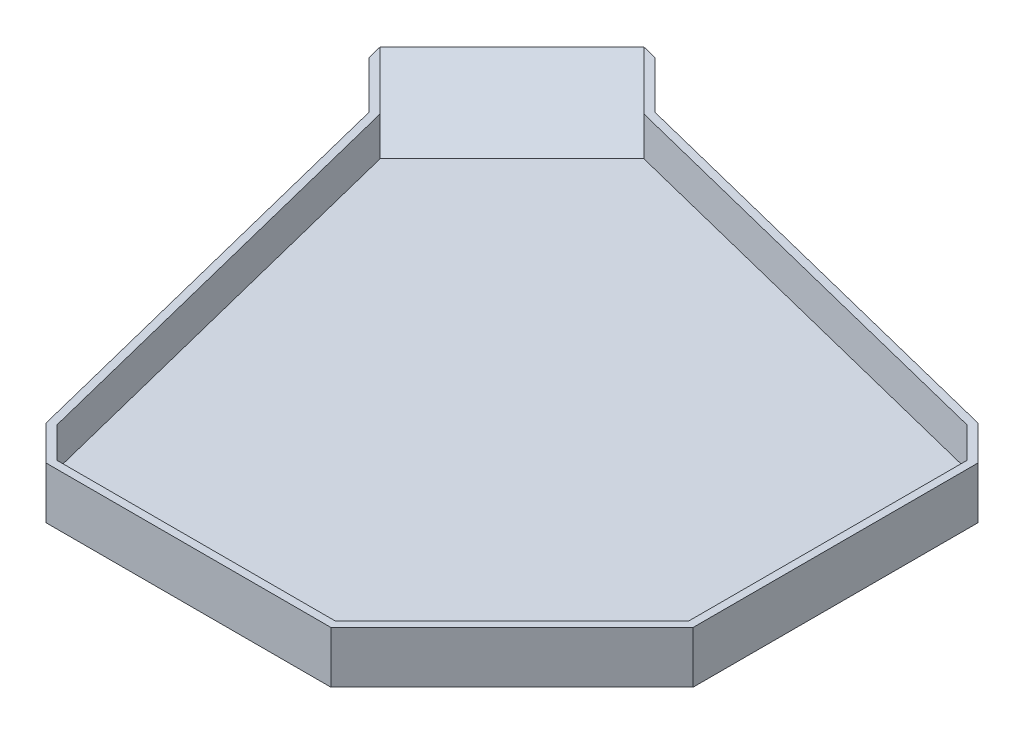
ISO-10303-21;
HEADER;
FILE_DESCRIPTION(('STEP AP214'),'2;1');
FILE_NAME('part.step','',(''),(''),'','','');
FILE_SCHEMA(('AUTOMOTIVE_DESIGN { 1 0 10303 214 1 1 1 1 }'));
ENDSEC;
DATA;
#1=APPLICATION_CONTEXT('core data for automotive mechanical design processes');
#2=APPLICATION_PROTOCOL_DEFINITION('international standard','automotive_design',2000,#1);
#3=PRODUCT_CONTEXT('',#1,'mechanical');
#4=PRODUCT('Part','Part','',(#3));
#5=PRODUCT_RELATED_PRODUCT_CATEGORY('part','',(#4));
#6=PRODUCT_DEFINITION_FORMATION('','',#4);
#7=PRODUCT_DEFINITION_CONTEXT('part definition',#1,'design');
#8=PRODUCT_DEFINITION('design','',#6,#7);
#9=PRODUCT_DEFINITION_SHAPE('','',#8);
#10=(LENGTH_UNIT() NAMED_UNIT(*) SI_UNIT(.MILLI.,.METRE.));
#11=(NAMED_UNIT(*) PLANE_ANGLE_UNIT() SI_UNIT($,.RADIAN.));
#12=(NAMED_UNIT(*) SI_UNIT($,.STERADIAN.) SOLID_ANGLE_UNIT());
#13=UNCERTAINTY_MEASURE_WITH_UNIT(LENGTH_MEASURE(1.E-05),#10,'distance_accuracy_value','');
#14=(GEOMETRIC_REPRESENTATION_CONTEXT(3) GLOBAL_UNCERTAINTY_ASSIGNED_CONTEXT((#13)) GLOBAL_UNIT_ASSIGNED_CONTEXT((#10,
#11,#12)) REPRESENTATION_CONTEXT('',''));
#15=CARTESIAN_POINT('',(0.,0.,0.));
#16=DIRECTION('',(0.,0.,1.));
#17=DIRECTION('',(1.,0.,0.));
#18=AXIS2_PLACEMENT_3D('',#15,#16,#17);
#19=CARTESIAN_POINT('',(0.,5.,0.));
#20=DIRECTION('',(0.,1.,0.));
#21=DIRECTION('',(0.,0.,1.));
#22=AXIS2_PLACEMENT_3D('',#19,#20,#21);
#23=PLANE('',#22);
#24=DIRECTION('',(0.970142500145332,0.,0.242535625036333));
#25=VECTOR('',#24,1.);
#26=CARTESIAN_POINT('',(175.132918042792,5.,-0.62444127008876));
#27=LINE('',#26,#25);
#28=CARTESIAN_POINT('',(8.67524312779766,5.,-42.2388599988373));
#29=VERTEX_POINT('',#28);
#30=CARTESIAN_POINT('',(175.132918042792,5.,-0.62444127008876));
#31=VERTEX_POINT('',#30);
#32=EDGE_CURVE('E306',#29,#31,#27,.T.);
#33=ORIENTED_EDGE('',*,*,#32,.F.);
#34=DIRECTION('',(0.707106781186551,0.,-0.707106781186544));
#35=VECTOR('',#34,1.);
#36=CARTESIAN_POINT('',(-42.236445117634,5.,8.67282824659385));
#37=LINE('',#36,#35);
#38=CARTESIAN_POINT('',(-42.236445117634,5.,8.67282824659385));
#39=VERTEX_POINT('',#38);
#40=EDGE_CURVE('E231',#39,#29,#37,.T.);
#41=ORIENTED_EDGE('',*,*,#40,.F.);
#42=DIRECTION('',(0.707106781186544,0.,0.707106781186551));
#43=VECTOR('',#42,1.);
#44=CARTESIAN_POINT('',(-42.236445117634,5.,8.67282824659385));
#45=LINE('',#44,#43);
#46=CARTESIAN_POINT('',(-64.6470248375392,5.,-13.7377514733116));
#47=VERTEX_POINT('',#46);
#48=EDGE_CURVE('E218',#47,#39,#45,.T.);
#49=ORIENTED_EDGE('',*,*,#48,.F.);
#50=DIRECTION('',(0.707106781186547,0.,-0.707106781186548));
#51=VECTOR('',#50,1.);
#52=CARTESIAN_POINT('',(-13.7353365921076,5.,-64.6494397187426));
#53=LINE('',#52,#51);
#54=CARTESIAN_POINT('',(-64.6494397187426,5.,-13.7353365921076));
#55=VERTEX_POINT('',#54);
#56=EDGE_CURVE('E230',#55,#47,#53,.T.);
#57=ORIENTED_EDGE('',*,*,#56,.F.);
#58=DIRECTION('',(-0.707106781186547,0.,-0.707106781186548));
#59=VECTOR('',#58,1.);
#60=CARTESIAN_POINT('',(-42.2388599988374,5.,8.67524312779763));
#61=LINE('',#60,#59);
#62=CARTESIAN_POINT('',(-42.2388599988374,5.,8.67524312779763));
#63=VERTEX_POINT('',#62);
#64=EDGE_CURVE('E60',#63,#55,#61,.T.);
#65=ORIENTED_EDGE('',*,*,#64,.F.);
#66=DIRECTION('',(-0.242535625036333,0.,-0.970142500145332));
#67=VECTOR('',#66,1.);
#68=CARTESIAN_POINT('',(-0.624441270088747,5.,175.132918042792));
#69=LINE('',#68,#67);
#70=CARTESIAN_POINT('',(-0.624441270088747,5.,175.132918042792));
#71=VERTEX_POINT('',#70);
#72=EDGE_CURVE('E64',#71,#63,#69,.T.);
#73=ORIENTED_EDGE('',*,*,#72,.F.);
#74=DIRECTION('',(-0.707106781186549,0.,-0.707106781186546));
#75=VECTOR('',#74,1.);
#76=CARTESIAN_POINT('',(-0.624441270088747,5.,175.132918042792));
#77=LINE('',#76,#75);
#78=CARTESIAN_POINT('',(11.2426406871193,5.,187.));
#79=VERTEX_POINT('',#78);
#80=EDGE_CURVE('E326',#79,#71,#77,.T.);
#81=ORIENTED_EDGE('',*,*,#80,.F.);
#82=DIRECTION('',(-1.,0.,0.));
#83=VECTOR('',#82,1.);
#84=CARTESIAN_POINT('',(11.2426406871193,5.,187.));
#85=LINE('',#84,#83);
#86=CARTESIAN_POINT('',(118.757359312881,5.,187.));
#87=VERTEX_POINT('',#86);
#88=EDGE_CURVE('E322',#87,#79,#85,.T.);
#89=ORIENTED_EDGE('',*,*,#88,.F.);
#90=DIRECTION('',(-0.707106781186546,0.,0.707106781186549));
#91=VECTOR('',#90,1.);
#92=CARTESIAN_POINT('',(118.757359312881,5.,187.));
#93=LINE('',#92,#91);
#94=CARTESIAN_POINT('',(187.,5.,118.757359312881));
#95=VERTEX_POINT('',#94);
#96=EDGE_CURVE('E318',#95,#87,#93,.T.);
#97=ORIENTED_EDGE('',*,*,#96,.F.);
#98=DIRECTION('',(0.,0.,1.));
#99=VECTOR('',#98,1.);
#100=CARTESIAN_POINT('',(187.,5.,118.757359312881));
#101=LINE('',#100,#99);
#102=CARTESIAN_POINT('',(187.,5.,11.2426406871192));
#103=VERTEX_POINT('',#102);
#104=EDGE_CURVE('E314',#103,#95,#101,.T.);
#105=ORIENTED_EDGE('',*,*,#104,.F.);
#106=DIRECTION('',(0.70710678118655,0.,0.707106781186545));
#107=VECTOR('',#106,1.);
#108=CARTESIAN_POINT('',(187.,5.,11.2426406871192));
#109=LINE('',#108,#107);
#110=EDGE_CURVE('E310',#31,#103,#109,.T.);
#111=ORIENTED_EDGE('',*,*,#110,.F.);
#112=EDGE_LOOP('',(#33,#41,#49,#57,#65,#73,#81,#89,#97,#105,#111));
#113=FACE_BOUND('',#112,.T.);
#114=ADVANCED_FACE('F43',(#113),#23,.T.);
#115=CARTESIAN_POINT('',(8.67524312779766,20.,-42.2388599988373));
#116=DIRECTION('',(0.707106781186551,0.,-0.707106781186544));
#117=DIRECTION('',(-0.707106781186544,0.,-0.707106781186551));
#118=AXIS2_PLACEMENT_3D('',#115,#116,#117);
#119=PLANE('',#118);
#120=DIRECTION('',(-0.639137716672717,0.42779195674155,-0.639137716672723));
#121=VECTOR('',#120,1.);
#122=CARTESIAN_POINT('',(-13.7353365921075,20.,-64.6494397187427));
#123=LINE('',#122,#121);
#124=CARTESIAN_POINT('',(-13.7353365921076,20.,-64.6494397187426));
#125=VERTEX_POINT('',#124);
#126=EDGE_CURVE('E226',#29,#125,#123,.T.);
#127=ORIENTED_EDGE('',*,*,#126,.F.);
#128=DIRECTION('',(0.,-1.,0.));
#129=VECTOR('',#128,1.);
#130=CARTESIAN_POINT('',(8.67524312779766,20.,-42.2388599988373));
#131=LINE('',#130,#129);
#132=CARTESIAN_POINT('',(8.67524312779766,20.,-42.2388599988373));
#133=VERTEX_POINT('',#132);
#134=EDGE_CURVE('E358',#133,#29,#131,.T.);
#135=ORIENTED_EDGE('',*,*,#134,.F.);
#136=DIRECTION('',(0.707106781186544,0.,0.707106781186551));
#137=VECTOR('',#136,1.);
#138=CARTESIAN_POINT('',(8.67524312779766,20.,-42.2388599988373));
#139=LINE('',#138,#137);
#140=EDGE_CURVE('E279',#125,#133,#139,.T.);
#141=ORIENTED_EDGE('',*,*,#140,.F.);
#142=EDGE_LOOP('',(#127,#135,#141));
#143=FACE_BOUND('',#142,.T.);
#144=ADVANCED_FACE('F564',(#143),#119,.F.);
#145=CARTESIAN_POINT('',(-39.3933982822018,-15.,0.606601717798213));
#146=DIRECTION('',(-0.707106781186548,0.,-0.707106781186547));
#147=DIRECTION('',(-0.707106781186547,0.,0.707106781186548));
#148=AXIS2_PLACEMENT_3D('',#145,#146,#147);
#149=PLANE('',#148);
#150=DIRECTION('',(0.707106781186548,0.,-0.707106781186547));
#151=VECTOR('',#150,1.);
#152=CARTESIAN_POINT('',(-41.8198051533946,-7.5,3.03300858899107));
#153=LINE('',#152,#151);
#154=CARTESIAN_POINT('',(-39.3933982822018,-7.5,0.60660171779821));
#155=VERTEX_POINT('',#154);
#156=CARTESIAN_POINT('',(0.606601717798211,-7.5,-39.3933982822018));
#157=VERTEX_POINT('',#156);
#158=EDGE_CURVE('E373',#155,#157,#153,.T.);
#159=ORIENTED_EDGE('',*,*,#158,.T.);
#160=DIRECTION('',(0.,1.,0.));
#161=VECTOR('',#160,1.);
#162=CARTESIAN_POINT('',(0.606601717798211,-15.,-39.3933982822018));
#163=LINE('',#162,#161);
#164=CARTESIAN_POINT('',(0.606601717798211,0.,-39.3933982822018));
#165=VERTEX_POINT('',#164);
#166=EDGE_CURVE('E398',#157,#165,#163,.T.);
#167=ORIENTED_EDGE('',*,*,#166,.T.);
#168=DIRECTION('',(-0.707106781186547,0.,0.707106781186548));
#169=VECTOR('',#168,1.);
#170=CARTESIAN_POINT('',(-39.3933982822018,0.,0.606601717798213));
#171=LINE('',#170,#169);
#172=CARTESIAN_POINT('',(-39.3933982822018,0.,0.606601717798213));
#173=VERTEX_POINT('',#172);
#174=EDGE_CURVE('E384',#165,#173,#171,.T.);
#175=ORIENTED_EDGE('',*,*,#174,.T.);
#176=DIRECTION('',(0.,1.,0.));
#177=VECTOR('',#176,1.);
#178=CARTESIAN_POINT('',(-39.3933982822018,-15.,0.606601717798213));
#179=LINE('',#178,#177);
#180=EDGE_CURVE('E395',#155,#173,#179,.T.);
#181=ORIENTED_EDGE('',*,*,#180,.F.);
#182=EDGE_LOOP('',(#159,#167,#175,#181));
#183=FACE_BOUND('',#182,.T.);
#184=ADVANCED_FACE('F603',(#183),#149,.F.);
#185=CARTESIAN_POINT('',(0.,0.,0.));
#186=DIRECTION('',(0.,1.,0.));
#187=DIRECTION('',(0.,0.,1.));
#188=AXIS2_PLACEMENT_3D('',#185,#186,#187);
#189=PLANE('',#188);
#190=DIRECTION('',(-0.707106781186547,0.,-0.707106781186548));
#191=VECTOR('',#190,1.);
#192=CARTESIAN_POINT('',(-8.07848234261526,0.,-63.2352261563695));
#193=LINE('',#192,#191);
#194=CARTESIAN_POINT('',(10.2089917516723,0.,-44.9477520620819));
#195=VERTEX_POINT('',#194);
#196=CARTESIAN_POINT('',(-8.07848234261526,0.,-63.2352261563695));
#197=VERTEX_POINT('',#196);
#198=EDGE_CURVE('E479',#195,#197,#193,.T.);
#199=ORIENTED_EDGE('',*,*,#198,.F.);
#200=DIRECTION('',(-0.970142500145332,0.,-0.242535625036333));
#201=VECTOR('',#200,1.);
#202=CARTESIAN_POINT('',(-10.,0.,-50.));
#203=LINE('',#202,#201);
#204=CARTESIAN_POINT('',(176.666666666667,0.,-3.33333333333332));
#205=VERTEX_POINT('',#204);
#206=EDGE_CURVE('E424',#205,#195,#203,.T.);
#207=ORIENTED_EDGE('',*,*,#206,.F.);
#208=DIRECTION('',(-0.707106781186548,0.,-0.707106781186547));
#209=VECTOR('',#208,1.);
#210=CARTESIAN_POINT('',(176.666666666667,0.,-3.33333333333332));
#211=LINE('',#210,#209);
#212=CARTESIAN_POINT('',(190.,0.,10.));
#213=VERTEX_POINT('',#212);
#214=EDGE_CURVE('E421',#213,#205,#211,.T.);
#215=ORIENTED_EDGE('',*,*,#214,.F.);
#216=DIRECTION('',(0.,0.,-1.));
#217=VECTOR('',#216,1.);
#218=CARTESIAN_POINT('',(190.,0.,10.));
#219=LINE('',#218,#217);
#220=CARTESIAN_POINT('',(190.,0.,120.));
#221=VERTEX_POINT('',#220);
#222=EDGE_CURVE('E418',#221,#213,#219,.T.);
#223=ORIENTED_EDGE('',*,*,#222,.F.);
#224=DIRECTION('',(0.707106781186548,0.,-0.707106781186547));
#225=VECTOR('',#224,1.);
#226=CARTESIAN_POINT('',(190.,0.,120.));
#227=LINE('',#226,#225);
#228=CARTESIAN_POINT('',(120.,0.,190.));
#229=VERTEX_POINT('',#228);
#230=EDGE_CURVE('E415',#229,#221,#227,.T.);
#231=ORIENTED_EDGE('',*,*,#230,.F.);
#232=DIRECTION('',(1.,0.,0.));
#233=VECTOR('',#232,1.);
#234=CARTESIAN_POINT('',(10.,0.,190.));
#235=LINE('',#234,#233);
#236=CARTESIAN_POINT('',(10.,0.,190.));
#237=VERTEX_POINT('',#236);
#238=EDGE_CURVE('E412',#237,#229,#235,.T.);
#239=ORIENTED_EDGE('',*,*,#238,.F.);
#240=DIRECTION('',(0.707106781186549,0.,0.707106781186547));
#241=VECTOR('',#240,1.);
#242=CARTESIAN_POINT('',(-3.33333333333332,0.,176.666666666667));
#243=LINE('',#242,#241);
#244=CARTESIAN_POINT('',(-3.33333333333332,0.,176.666666666667));
#245=VERTEX_POINT('',#244);
#246=EDGE_CURVE('E409',#245,#237,#243,.T.);
#247=ORIENTED_EDGE('',*,*,#246,.F.);
#248=DIRECTION('',(0.242535625036333,0.,0.970142500145332));
#249=VECTOR('',#248,1.);
#250=CARTESIAN_POINT('',(-50.,0.,-10.));
#251=LINE('',#250,#249);
#252=CARTESIAN_POINT('',(-44.9477520620819,0.,10.2089917516724));
#253=VERTEX_POINT('',#252);
#254=EDGE_CURVE('E406',#253,#245,#251,.T.);
#255=ORIENTED_EDGE('',*,*,#254,.F.);
#256=DIRECTION('',(0.707106781186547,0.,0.707106781186548));
#257=VECTOR('',#256,1.);
#258=CARTESIAN_POINT('',(-63.2352261563695,0.,-8.07848234261524));
#259=LINE('',#258,#257);
#260=CARTESIAN_POINT('',(-63.2352261563695,0.,-8.07848234261524));
#261=VERTEX_POINT('',#260);
#262=EDGE_CURVE('E499',#261,#253,#259,.T.);
#263=ORIENTED_EDGE('',*,*,#262,.F.);
#264=DIRECTION('',(0.242535625036334,0.,0.970142500145331));
#265=VECTOR('',#264,1.);
#266=CARTESIAN_POINT('',(-64.6494397187426,0.,-13.7353365921076));
#267=LINE('',#266,#265);
#268=CARTESIAN_POINT('',(-64.6494397187426,0.,-13.7353365921076));
#269=VERTEX_POINT('',#268);
#270=EDGE_CURVE('E495',#269,#261,#267,.T.);
#271=ORIENTED_EDGE('',*,*,#270,.F.);
#272=DIRECTION('',(-0.707106781186548,0.,0.707106781186548));
#273=VECTOR('',#272,1.);
#274=CARTESIAN_POINT('',(-13.7353365921076,0.,-64.6494397187426));
#275=LINE('',#274,#273);
#276=CARTESIAN_POINT('',(-13.7353365921076,0.,-64.6494397187426));
#277=VERTEX_POINT('',#276);
#278=EDGE_CURVE('E245',#277,#269,#275,.T.);
#279=ORIENTED_EDGE('',*,*,#278,.F.);
#280=DIRECTION('',(-0.970142500145332,0.,-0.242535625036333));
#281=VECTOR('',#280,1.);
#282=CARTESIAN_POINT('',(-13.7353365921076,0.,-64.6494397187426));
#283=LINE('',#282,#281);
#284=EDGE_CURVE('E481',#197,#277,#283,.T.);
#285=ORIENTED_EDGE('',*,*,#284,.F.);
#286=EDGE_LOOP('',(#199,#207,#215,#223,#231,#239,#247,#255,#263,#271,#279,#285));
#287=FACE_BOUND('',#286,.T.);
#288=ORIENTED_EDGE('',*,*,#174,.F.);
#289=DIRECTION('',(0.707106781186547,0.,0.707106781186548));
#290=VECTOR('',#289,1.);
#291=CARTESIAN_POINT('',(0.606601717798211,0.,-39.3933982822018));
#292=LINE('',#291,#290);
#293=CARTESIAN_POINT('',(-10.,0.,-50.));
#294=VERTEX_POINT('',#293);
#295=EDGE_CURVE('E381',#294,#165,#292,.T.);
#296=ORIENTED_EDGE('',*,*,#295,.F.);
#297=DIRECTION('',(0.707106781186547,0.,-0.707106781186548));
#298=VECTOR('',#297,1.);
#299=CARTESIAN_POINT('',(-50.,0.,-10.));
#300=LINE('',#299,#298);
#301=CARTESIAN_POINT('',(-50.,0.,-10.));
#302=VERTEX_POINT('',#301);
#303=EDGE_CURVE('E240',#302,#294,#300,.T.);
#304=ORIENTED_EDGE('',*,*,#303,.F.);
#305=DIRECTION('',(-0.707106781186548,0.,-0.707106781186547));
#306=VECTOR('',#305,1.);
#307=CARTESIAN_POINT('',(-50.,0.,-10.));
#308=LINE('',#307,#306);
#309=EDGE_CURVE('E388',#173,#302,#308,.T.);
#310=ORIENTED_EDGE('',*,*,#309,.F.);
#311=EDGE_LOOP('',(#288,#296,#304,#310));
#312=FACE_BOUND('',#311,.T.);
#313=ADVANCED_FACE('F456',(#287,#312),#189,.F.);
#314=CARTESIAN_POINT('',(-50.,5.,-10.));
#315=DIRECTION('',(0.970142500145332,0.,-0.242535625036333));
#316=DIRECTION('',(-0.242535625036333,0.,-0.970142500145332));
#317=AXIS2_PLACEMENT_3D('',#314,#315,#316);
#318=PLANE('',#317);
#319=DIRECTION('',(0.242535625036333,0.,0.970142500145332));
#320=VECTOR('',#319,1.);
#321=CARTESIAN_POINT('',(-46.361965624455,20.,4.55213750217998));
#322=LINE('',#321,#320);
#323=CARTESIAN_POINT('',(-44.9477520620819,20.,10.2089917516724));
#324=VERTEX_POINT('',#323);
#325=CARTESIAN_POINT('',(-3.33333333333332,20.,176.666666666667));
#326=VERTEX_POINT('',#325);
#327=EDGE_CURVE('E252',#324,#326,#322,.T.);
#328=ORIENTED_EDGE('',*,*,#327,.F.);
#329=DIRECTION('',(0.,1.,0.));
#330=VECTOR('',#329,1.);
#331=CARTESIAN_POINT('',(-44.9477520620819,0.,10.2089917516724));
#332=LINE('',#331,#330);
#333=EDGE_CURVE('E511',#253,#324,#332,.T.);
#334=ORIENTED_EDGE('',*,*,#333,.F.);
#335=ORIENTED_EDGE('',*,*,#254,.T.);
#336=DIRECTION('',(0.,-1.,0.));
#337=VECTOR('',#336,1.);
#338=CARTESIAN_POINT('',(-3.33333333333332,5.,176.666666666667));
#339=LINE('',#338,#337);
#340=EDGE_CURVE('E11',#326,#245,#339,.T.);
#341=ORIENTED_EDGE('',*,*,#340,.F.);
#342=EDGE_LOOP('',(#328,#334,#335,#341));
#343=FACE_BOUND('',#342,.T.);
#344=ADVANCED_FACE('F45',(#343),#318,.F.);
#345=CARTESIAN_POINT('',(-3.33333333333332,5.,176.666666666667));
#346=DIRECTION('',(0.707106781186547,0.,-0.707106781186549));
#347=DIRECTION('',(-0.707106781186549,0.,-0.707106781186547));
#348=AXIS2_PLACEMENT_3D('',#345,#346,#347);
#349=PLANE('',#348);
#350=ORIENTED_EDGE('',*,*,#246,.T.);
#351=DIRECTION('',(0.,-1.,0.));
#352=VECTOR('',#351,1.);
#353=CARTESIAN_POINT('',(10.,5.,190.));
#354=LINE('',#353,#352);
#355=CARTESIAN_POINT('',(10.,20.,190.));
#356=VERTEX_POINT('',#355);
#357=EDGE_CURVE('E53',#356,#237,#354,.T.);
#358=ORIENTED_EDGE('',*,*,#357,.F.);
#359=DIRECTION('',(0.707106781186549,0.,0.707106781186547));
#360=VECTOR('',#359,1.);
#361=CARTESIAN_POINT('',(10.,20.,190.));
#362=LINE('',#361,#360);
#363=EDGE_CURVE('E255',#326,#356,#362,.T.);
#364=ORIENTED_EDGE('',*,*,#363,.F.);
#365=ORIENTED_EDGE('',*,*,#340,.T.);
#366=EDGE_LOOP('',(#350,#358,#364,#365));
#367=FACE_BOUND('',#366,.T.);
#368=ADVANCED_FACE('F624',(#367),#349,.F.);
#369=CARTESIAN_POINT('',(10.,5.,190.));
#370=DIRECTION('',(0.,0.,-1.));
#371=DIRECTION('',(-1.,0.,0.));
#372=AXIS2_PLACEMENT_3D('',#369,#370,#371);
#373=PLANE('',#372);
#374=ORIENTED_EDGE('',*,*,#238,.T.);
#375=DIRECTION('',(0.,-1.,0.));
#376=VECTOR('',#375,1.);
#377=CARTESIAN_POINT('',(120.,5.,190.));
#378=LINE('',#377,#376);
#379=CARTESIAN_POINT('',(120.,20.,190.));
#380=VERTEX_POINT('',#379);
#381=EDGE_CURVE('E440',#380,#229,#378,.T.);
#382=ORIENTED_EDGE('',*,*,#381,.F.);
#383=DIRECTION('',(1.,0.,0.));
#384=VECTOR('',#383,1.);
#385=CARTESIAN_POINT('',(120.,20.,190.));
#386=LINE('',#385,#384);
#387=EDGE_CURVE('E259',#356,#380,#386,.T.);
#388=ORIENTED_EDGE('',*,*,#387,.F.);
#389=ORIENTED_EDGE('',*,*,#357,.T.);
#390=EDGE_LOOP('',(#374,#382,#388,#389));
#391=FACE_BOUND('',#390,.T.);
#392=ADVANCED_FACE('F449',(#391),#373,.F.);
#393=CARTESIAN_POINT('',(190.,5.,120.));
#394=DIRECTION('',(-0.707106781186547,0.,-0.707106781186548));
#395=DIRECTION('',(-0.707106781186548,0.,0.707106781186547));
#396=AXIS2_PLACEMENT_3D('',#393,#394,#395);
#397=PLANE('',#396);
#398=ORIENTED_EDGE('',*,*,#230,.T.);
#399=DIRECTION('',(0.,-1.,0.));
#400=VECTOR('',#399,1.);
#401=CARTESIAN_POINT('',(190.,5.,120.));
#402=LINE('',#401,#400);
#403=CARTESIAN_POINT('',(190.,20.,120.));
#404=VERTEX_POINT('',#403);
#405=EDGE_CURVE('E436',#404,#221,#402,.T.);
#406=ORIENTED_EDGE('',*,*,#405,.F.);
#407=DIRECTION('',(0.707106781186548,0.,-0.707106781186547));
#408=VECTOR('',#407,1.);
#409=CARTESIAN_POINT('',(190.,20.,120.));
#410=LINE('',#409,#408);
#411=EDGE_CURVE('E263',#380,#404,#410,.T.);
#412=ORIENTED_EDGE('',*,*,#411,.F.);
#413=ORIENTED_EDGE('',*,*,#381,.T.);
#414=EDGE_LOOP('',(#398,#406,#412,#413));
#415=FACE_BOUND('',#414,.T.);
#416=ADVANCED_FACE('F462',(#415),#397,.F.);
#417=CARTESIAN_POINT('',(190.,5.,10.));
#418=DIRECTION('',(-1.,0.,0.));
#419=DIRECTION('',(0.,0.,1.));
#420=AXIS2_PLACEMENT_3D('',#417,#418,#419);
#421=PLANE('',#420);
#422=ORIENTED_EDGE('',*,*,#222,.T.);
#423=DIRECTION('',(0.,-1.,0.));
#424=VECTOR('',#423,1.);
#425=CARTESIAN_POINT('',(190.,5.,10.));
#426=LINE('',#425,#424);
#427=CARTESIAN_POINT('',(190.,20.,10.));
#428=VERTEX_POINT('',#427);
#429=EDGE_CURVE('E432',#428,#213,#426,.T.);
#430=ORIENTED_EDGE('',*,*,#429,.F.);
#431=DIRECTION('',(0.,0.,-1.));
#432=VECTOR('',#431,1.);
#433=CARTESIAN_POINT('',(190.,20.,10.));
#434=LINE('',#433,#432);
#435=EDGE_CURVE('E267',#404,#428,#434,.T.);
#436=ORIENTED_EDGE('',*,*,#435,.F.);
#437=ORIENTED_EDGE('',*,*,#405,.T.);
#438=EDGE_LOOP('',(#422,#430,#436,#437));
#439=FACE_BOUND('',#438,.T.);
#440=ADVANCED_FACE('F466',(#439),#421,.F.);
#441=CARTESIAN_POINT('',(176.666666666667,5.,-3.33333333333332));
#442=DIRECTION('',(-0.707106781186547,0.,0.707106781186548));
#443=DIRECTION('',(0.707106781186548,0.,0.707106781186547));
#444=AXIS2_PLACEMENT_3D('',#441,#442,#443);
#445=PLANE('',#444);
#446=ORIENTED_EDGE('',*,*,#214,.T.);
#447=DIRECTION('',(0.,-1.,0.));
#448=VECTOR('',#447,1.);
#449=CARTESIAN_POINT('',(176.666666666667,5.,-3.33333333333332));
#450=LINE('',#449,#448);
#451=CARTESIAN_POINT('',(176.666666666667,20.,-3.33333333333332));
#452=VERTEX_POINT('',#451);
#453=EDGE_CURVE('E428',#452,#205,#450,.T.);
#454=ORIENTED_EDGE('',*,*,#453,.F.);
#455=DIRECTION('',(-0.707106781186548,0.,-0.707106781186547));
#456=VECTOR('',#455,1.);
#457=CARTESIAN_POINT('',(176.666666666667,20.,-3.33333333333332));
#458=LINE('',#457,#456);
#459=EDGE_CURVE('E271',#428,#452,#458,.T.);
#460=ORIENTED_EDGE('',*,*,#459,.F.);
#461=ORIENTED_EDGE('',*,*,#429,.T.);
#462=EDGE_LOOP('',(#446,#454,#460,#461));
#463=FACE_BOUND('',#462,.T.);
#464=ADVANCED_FACE('F472',(#463),#445,.F.);
#465=CARTESIAN_POINT('',(-10.,5.,-50.));
#466=DIRECTION('',(-0.242535625036333,0.,0.970142500145332));
#467=DIRECTION('',(0.970142500145332,0.,0.242535625036333));
#468=AXIS2_PLACEMENT_3D('',#465,#466,#467);
#469=PLANE('',#468);
#470=ORIENTED_EDGE('',*,*,#206,.T.);
#471=DIRECTION('',(0.,1.,0.));
#472=VECTOR('',#471,1.);
#473=CARTESIAN_POINT('',(10.2089917516723,0.,-44.9477520620819));
#474=LINE('',#473,#472);
#475=CARTESIAN_POINT('',(10.2089917516723,20.,-44.9477520620819));
#476=VERTEX_POINT('',#475);
#477=EDGE_CURVE('E491',#195,#476,#474,.T.);
#478=ORIENTED_EDGE('',*,*,#477,.T.);
#479=DIRECTION('',(-0.970142500145332,0.,-0.242535625036333));
#480=VECTOR('',#479,1.);
#481=CARTESIAN_POINT('',(4.55213750218,20.,-46.361965624455));
#482=LINE('',#481,#480);
#483=EDGE_CURVE('E275',#452,#476,#482,.T.);
#484=ORIENTED_EDGE('',*,*,#483,.F.);
#485=ORIENTED_EDGE('',*,*,#453,.T.);
#486=EDGE_LOOP('',(#470,#478,#484,#485));
#487=FACE_BOUND('',#486,.T.);
#488=ADVANCED_FACE('F475',(#487),#469,.F.);
#489=CARTESIAN_POINT('',(-50.,5.,-10.));
#490=DIRECTION('',(0.707106781186548,0.,0.707106781186547));
#491=DIRECTION('',(0.707106781186547,0.,-0.707106781186548));
#492=AXIS2_PLACEMENT_3D('',#489,#490,#491);
#493=PLANE('',#492);
#494=DIRECTION('',(0.,1.,0.));
#495=VECTOR('',#494,1.);
#496=CARTESIAN_POINT('',(-50.,-15.,-10.));
#497=LINE('',#496,#495);
#498=CARTESIAN_POINT('',(-50.,-7.50000000000003,-10.));
#499=VERTEX_POINT('',#498);
#500=EDGE_CURVE('E391',#499,#302,#497,.T.);
#501=ORIENTED_EDGE('',*,*,#500,.T.);
#502=ORIENTED_EDGE('',*,*,#303,.T.);
#503=DIRECTION('',(0.,1.,0.));
#504=VECTOR('',#503,1.);
#505=CARTESIAN_POINT('',(-10.,-15.,-50.));
#506=LINE('',#505,#504);
#507=CARTESIAN_POINT('',(-9.99999999999999,-7.50000000000003,-50.));
#508=VERTEX_POINT('',#507);
#509=EDGE_CURVE('E402',#508,#294,#506,.T.);
#510=ORIENTED_EDGE('',*,*,#509,.F.);
#511=DIRECTION('',(0.707106781186548,0.,-0.707106781186547));
#512=VECTOR('',#511,1.);
#513=CARTESIAN_POINT('',(-52.4264068711929,-7.50000000000003,-7.57359312880716));
#514=LINE('',#513,#512);
#515=EDGE_CURVE('E366',#499,#508,#514,.T.);
#516=ORIENTED_EDGE('',*,*,#515,.F.);
#517=EDGE_LOOP('',(#501,#502,#510,#516));
#518=FACE_BOUND('',#517,.T.);
#519=ADVANCED_FACE('F611',(#518),#493,.F.);
#520=CARTESIAN_POINT('',(0.606601717798211,-15.,-39.3933982822018));
#521=DIRECTION('',(-0.707106781186548,0.,0.707106781186547));
#522=DIRECTION('',(0.707106781186547,0.,0.707106781186548));
#523=AXIS2_PLACEMENT_3D('',#520,#521,#522);
#524=PLANE('',#523);
#525=CARTESIAN_POINT('',(-4.69669914110088,-7.5,-44.6966991411009));
#526=DIRECTION('',(0.707106781186548,0.,-0.707106781186547));
#527=DIRECTION('',(-0.707106781186547,0.,-0.707106781186548));
#528=AXIS2_PLACEMENT_3D('',#525,#526,#527);
#529=CIRCLE('',#528,4.);
#530=CARTESIAN_POINT('',(-7.52512626584708,-7.5,-47.5251262658471));
#531=VERTEX_POINT('',#530);
#532=EDGE_CURVE('E362',#531,#531,#529,.T.);
#533=ORIENTED_EDGE('',*,*,#532,.F.);
#534=EDGE_LOOP('',(#533));
#535=FACE_BOUND('',#534,.T.);
#536=CARTESIAN_POINT('',(-4.69669914110091,-7.49999999999998,-44.6966991411009));
#537=DIRECTION('',(-0.707106781186548,0.,0.707106781186547));
#538=DIRECTION('',(-0.707106781186547,0.,-0.707106781186548));
#539=AXIS2_PLACEMENT_3D('',#536,#537,#538);
#540=CIRCLE('',#539,7.50000000000002);
#541=EDGE_CURVE('E370',#508,#157,#540,.T.);
#542=ORIENTED_EDGE('',*,*,#541,.F.);
#543=ORIENTED_EDGE('',*,*,#509,.T.);
#544=ORIENTED_EDGE('',*,*,#295,.T.);
#545=ORIENTED_EDGE('',*,*,#166,.F.);
#546=EDGE_LOOP('',(#542,#543,#544,#545));
#547=FACE_BOUND('',#546,.T.);
#548=ADVANCED_FACE('F607',(#535,#547),#524,.F.);
#549=CARTESIAN_POINT('',(-50.,-15.,-10.));
#550=DIRECTION('',(0.707106781186547,0.,-0.707106781186548));
#551=DIRECTION('',(-0.707106781186548,0.,-0.707106781186547));
#552=AXIS2_PLACEMENT_3D('',#549,#550,#551);
#553=PLANE('',#552);
#554=CARTESIAN_POINT('',(-44.6966991411009,-7.5,-4.6966991411009));
#555=DIRECTION('',(0.707106781186547,0.,-0.707106781186548));
#556=DIRECTION('',(-0.707106781186548,0.,-0.707106781186547));
#557=AXIS2_PLACEMENT_3D('',#554,#555,#556);
#558=CIRCLE('',#557,4.);
#559=CARTESIAN_POINT('',(-47.5251262658471,-7.5,-7.52512626584709));
#560=VERTEX_POINT('',#559);
#561=EDGE_CURVE('E47',#560,#560,#558,.T.);
#562=ORIENTED_EDGE('',*,*,#561,.T.);
#563=EDGE_LOOP('',(#562));
#564=FACE_BOUND('',#563,.T.);
#565=ORIENTED_EDGE('',*,*,#500,.F.);
#566=CARTESIAN_POINT('',(-44.6966991411009,-7.49999999999998,-4.69669914110091));
#567=DIRECTION('',(0.707106781186547,0.,-0.707106781186548));
#568=DIRECTION('',(-0.707106781186548,0.,-0.707106781186547));
#569=AXIS2_PLACEMENT_3D('',#566,#567,#568);
#570=CIRCLE('',#569,7.50000000000002);
#571=EDGE_CURVE('E377',#499,#155,#570,.F.);
#572=ORIENTED_EDGE('',*,*,#571,.T.);
#573=ORIENTED_EDGE('',*,*,#180,.T.);
#574=ORIENTED_EDGE('',*,*,#309,.T.);
#575=EDGE_LOOP('',(#565,#572,#573,#574));
#576=FACE_BOUND('',#575,.T.);
#577=ADVANCED_FACE('F672',(#564,#576),#553,.F.);
#578=CARTESIAN_POINT('',(-47.1231060122938,-7.49999999999998,-2.27029226990805));
#579=DIRECTION('',(0.707106781186548,0.,-0.707106781186547));
#580=DIRECTION('',(-0.707106781186547,0.,-0.707106781186548));
#581=AXIS2_PLACEMENT_3D('',#578,#579,#580);
#582=CYLINDRICAL_SURFACE('',#581,7.50000000000002);
#583=ORIENTED_EDGE('',*,*,#571,.F.);
#584=ORIENTED_EDGE('',*,*,#515,.T.);
#585=ORIENTED_EDGE('',*,*,#541,.T.);
#586=ORIENTED_EDGE('',*,*,#158,.F.);
#587=EDGE_LOOP('',(#583,#584,#585,#586));
#588=FACE_BOUND('',#587,.T.);
#589=ADVANCED_FACE('F668',(#588),#582,.T.);
#590=CARTESIAN_POINT('',(-47.1231060122937,-7.5,-2.27029226990805));
#591=DIRECTION('',(0.707106781186548,0.,-0.707106781186547));
#592=DIRECTION('',(-0.707106781186547,0.,-0.707106781186548));
#593=AXIS2_PLACEMENT_3D('',#590,#591,#592);
#594=CYLINDRICAL_SURFACE('',#593,4.);
#595=ORIENTED_EDGE('',*,*,#532,.T.);
#596=EDGE_LOOP('',(#595));
#597=FACE_BOUND('',#596,.T.);
#598=ORIENTED_EDGE('',*,*,#561,.F.);
#599=EDGE_LOOP('',(#598));
#600=FACE_BOUND('',#599,.T.);
#601=ADVANCED_FACE('F665',(#597,#600),#594,.F.);
#602=CARTESIAN_POINT('',(-42.2388599988374,20.,8.67524312779763));
#603=DIRECTION('',(-0.707106781186548,0.,0.707106781186547));
#604=DIRECTION('',(0.707106781186547,0.,0.707106781186548));
#605=AXIS2_PLACEMENT_3D('',#602,#603,#604);
#606=PLANE('',#605);
#607=ORIENTED_EDGE('',*,*,#64,.T.);
#608=DIRECTION('',(0.,1.,0.));
#609=VECTOR('',#608,1.);
#610=CARTESIAN_POINT('',(-64.6494397187426,0.,-13.7353365921076));
#611=LINE('',#610,#609);
#612=CARTESIAN_POINT('',(-64.6494397187426,20.,-13.7353365921076));
#613=VERTEX_POINT('',#612);
#614=EDGE_CURVE('E503',#55,#613,#611,.T.);
#615=ORIENTED_EDGE('',*,*,#614,.T.);
#616=DIRECTION('',(-0.707106781186547,0.,-0.707106781186548));
#617=VECTOR('',#616,1.);
#618=CARTESIAN_POINT('',(-42.2388599988374,20.,8.67524312779763));
#619=LINE('',#618,#617);
#620=CARTESIAN_POINT('',(-42.2388599988374,20.,8.67524312779763));
#621=VERTEX_POINT('',#620);
#622=EDGE_CURVE('E249',#621,#613,#619,.T.);
#623=ORIENTED_EDGE('',*,*,#622,.F.);
#624=DIRECTION('',(0.,-1.,0.));
#625=VECTOR('',#624,1.);
#626=CARTESIAN_POINT('',(-42.2388599988374,20.,8.67524312779763));
#627=LINE('',#626,#625);
#628=EDGE_CURVE('E303',#621,#63,#627,.T.);
#629=ORIENTED_EDGE('',*,*,#628,.T.);
#630=EDGE_LOOP('',(#607,#615,#623,#629));
#631=FACE_BOUND('',#630,.T.);
#632=ADVANCED_FACE('F531',(#631),#606,.F.);
#633=CARTESIAN_POINT('',(175.132918042792,20.,-0.62444127008876));
#634=DIRECTION('',(0.242535625036333,0.,-0.970142500145332));
#635=DIRECTION('',(-0.970142500145332,0.,-0.242535625036333));
#636=AXIS2_PLACEMENT_3D('',#633,#634,#635);
#637=PLANE('',#636);
#638=ORIENTED_EDGE('',*,*,#32,.T.);
#639=DIRECTION('',(0.,-1.,0.));
#640=VECTOR('',#639,1.);
#641=CARTESIAN_POINT('',(175.132918042792,20.,-0.62444127008876));
#642=LINE('',#641,#640);
#643=CARTESIAN_POINT('',(175.132918042792,20.,-0.62444127008876));
#644=VERTEX_POINT('',#643);
#645=EDGE_CURVE('E354',#644,#31,#642,.T.);
#646=ORIENTED_EDGE('',*,*,#645,.F.);
#647=DIRECTION('',(0.970142500145332,0.,0.242535625036333));
#648=VECTOR('',#647,1.);
#649=CARTESIAN_POINT('',(175.132918042792,20.,-0.62444127008876));
#650=LINE('',#649,#648);
#651=EDGE_CURVE('E282',#133,#644,#650,.T.);
#652=ORIENTED_EDGE('',*,*,#651,.F.);
#653=ORIENTED_EDGE('',*,*,#134,.T.);
#654=EDGE_LOOP('',(#638,#646,#652,#653));
#655=FACE_BOUND('',#654,.T.);
#656=ADVANCED_FACE('F558',(#655),#637,.F.);
#657=CARTESIAN_POINT('',(187.,20.,11.2426406871192));
#658=DIRECTION('',(0.707106781186546,0.,-0.70710678118655));
#659=DIRECTION('',(-0.70710678118655,0.,-0.707106781186546));
#660=AXIS2_PLACEMENT_3D('',#657,#658,#659);
#661=PLANE('',#660);
#662=ORIENTED_EDGE('',*,*,#110,.T.);
#663=DIRECTION('',(0.,-1.,0.));
#664=VECTOR('',#663,1.);
#665=CARTESIAN_POINT('',(187.,20.,11.2426406871192));
#666=LINE('',#665,#664);
#667=CARTESIAN_POINT('',(187.,20.,11.2426406871192));
#668=VERTEX_POINT('',#667);
#669=EDGE_CURVE('E350',#668,#103,#666,.T.);
#670=ORIENTED_EDGE('',*,*,#669,.F.);
#671=DIRECTION('',(0.70710678118655,0.,0.707106781186545));
#672=VECTOR('',#671,1.);
#673=CARTESIAN_POINT('',(187.,20.,11.2426406871192));
#674=LINE('',#673,#672);
#675=EDGE_CURVE('E285',#644,#668,#674,.T.);
#676=ORIENTED_EDGE('',*,*,#675,.F.);
#677=ORIENTED_EDGE('',*,*,#645,.T.);
#678=EDGE_LOOP('',(#662,#670,#676,#677));
#679=FACE_BOUND('',#678,.T.);
#680=ADVANCED_FACE('F555',(#679),#661,.F.);
#681=CARTESIAN_POINT('',(187.,20.,118.757359312881));
#682=DIRECTION('',(1.,0.,0.));
#683=DIRECTION('',(0.,0.,-1.));
#684=AXIS2_PLACEMENT_3D('',#681,#682,#683);
#685=PLANE('',#684);
#686=ORIENTED_EDGE('',*,*,#104,.T.);
#687=DIRECTION('',(0.,-1.,0.));
#688=VECTOR('',#687,1.);
#689=CARTESIAN_POINT('',(187.,20.,118.757359312881));
#690=LINE('',#689,#688);
#691=CARTESIAN_POINT('',(187.,20.,118.757359312881));
#692=VERTEX_POINT('',#691);
#693=EDGE_CURVE('E346',#692,#95,#690,.T.);
#694=ORIENTED_EDGE('',*,*,#693,.F.);
#695=DIRECTION('',(0.,0.,1.));
#696=VECTOR('',#695,1.);
#697=CARTESIAN_POINT('',(187.,20.,118.757359312881));
#698=LINE('',#697,#696);
#699=EDGE_CURVE('E288',#668,#692,#698,.T.);
#700=ORIENTED_EDGE('',*,*,#699,.F.);
#701=ORIENTED_EDGE('',*,*,#669,.T.);
#702=EDGE_LOOP('',(#686,#694,#700,#701));
#703=FACE_BOUND('',#702,.T.);
#704=ADVANCED_FACE('F550',(#703),#685,.F.);
#705=CARTESIAN_POINT('',(118.757359312881,20.,187.));
#706=DIRECTION('',(0.707106781186549,0.,0.707106781186546));
#707=DIRECTION('',(0.707106781186546,0.,-0.707106781186549));
#708=AXIS2_PLACEMENT_3D('',#705,#706,#707);
#709=PLANE('',#708);
#710=ORIENTED_EDGE('',*,*,#96,.T.);
#711=DIRECTION('',(0.,-1.,0.));
#712=VECTOR('',#711,1.);
#713=CARTESIAN_POINT('',(118.757359312881,20.,187.));
#714=LINE('',#713,#712);
#715=CARTESIAN_POINT('',(118.757359312881,20.,187.));
#716=VERTEX_POINT('',#715);
#717=EDGE_CURVE('E342',#716,#87,#714,.T.);
#718=ORIENTED_EDGE('',*,*,#717,.F.);
#719=DIRECTION('',(-0.707106781186546,0.,0.707106781186549));
#720=VECTOR('',#719,1.);
#721=CARTESIAN_POINT('',(118.757359312881,20.,187.));
#722=LINE('',#721,#720);
#723=EDGE_CURVE('E291',#692,#716,#722,.T.);
#724=ORIENTED_EDGE('',*,*,#723,.F.);
#725=ORIENTED_EDGE('',*,*,#693,.T.);
#726=EDGE_LOOP('',(#710,#718,#724,#725));
#727=FACE_BOUND('',#726,.T.);
#728=ADVANCED_FACE('F547',(#727),#709,.F.);
#729=CARTESIAN_POINT('',(11.2426406871193,20.,187.));
#730=DIRECTION('',(0.,0.,1.));
#731=DIRECTION('',(1.,0.,0.));
#732=AXIS2_PLACEMENT_3D('',#729,#730,#731);
#733=PLANE('',#732);
#734=ORIENTED_EDGE('',*,*,#88,.T.);
#735=DIRECTION('',(0.,-1.,0.));
#736=VECTOR('',#735,1.);
#737=CARTESIAN_POINT('',(11.2426406871193,20.,187.));
#738=LINE('',#737,#736);
#739=CARTESIAN_POINT('',(11.2426406871193,20.,187.));
#740=VERTEX_POINT('',#739);
#741=EDGE_CURVE('E338',#740,#79,#738,.T.);
#742=ORIENTED_EDGE('',*,*,#741,.F.);
#743=DIRECTION('',(-1.,0.,0.));
#744=VECTOR('',#743,1.);
#745=CARTESIAN_POINT('',(11.2426406871193,20.,187.));
#746=LINE('',#745,#744);
#747=EDGE_CURVE('E294',#716,#740,#746,.T.);
#748=ORIENTED_EDGE('',*,*,#747,.F.);
#749=ORIENTED_EDGE('',*,*,#717,.T.);
#750=EDGE_LOOP('',(#734,#742,#748,#749));
#751=FACE_BOUND('',#750,.T.);
#752=ADVANCED_FACE('F542',(#751),#733,.F.);
#753=CARTESIAN_POINT('',(-0.624441270088747,20.,175.132918042792));
#754=DIRECTION('',(-0.707106781186546,0.,0.707106781186549));
#755=DIRECTION('',(0.707106781186549,0.,0.707106781186546));
#756=AXIS2_PLACEMENT_3D('',#753,#754,#755);
#757=PLANE('',#756);
#758=ORIENTED_EDGE('',*,*,#80,.T.);
#759=DIRECTION('',(0.,-1.,0.));
#760=VECTOR('',#759,1.);
#761=CARTESIAN_POINT('',(-0.624441270088747,20.,175.132918042792));
#762=LINE('',#761,#760);
#763=CARTESIAN_POINT('',(-0.624441270088747,20.,175.132918042792));
#764=VERTEX_POINT('',#763);
#765=EDGE_CURVE('E334',#764,#71,#762,.T.);
#766=ORIENTED_EDGE('',*,*,#765,.F.);
#767=DIRECTION('',(-0.707106781186549,0.,-0.707106781186546));
#768=VECTOR('',#767,1.);
#769=CARTESIAN_POINT('',(-0.624441270088747,20.,175.132918042792));
#770=LINE('',#769,#768);
#771=EDGE_CURVE('E297',#740,#764,#770,.T.);
#772=ORIENTED_EDGE('',*,*,#771,.F.);
#773=ORIENTED_EDGE('',*,*,#741,.T.);
#774=EDGE_LOOP('',(#758,#766,#772,#773));
#775=FACE_BOUND('',#774,.T.);
#776=ADVANCED_FACE('F539',(#775),#757,.F.);
#777=CARTESIAN_POINT('',(-0.624441270088747,20.,175.132918042792));
#778=DIRECTION('',(-0.970142500145332,0.,0.242535625036333));
#779=DIRECTION('',(0.242535625036333,0.,0.970142500145332));
#780=AXIS2_PLACEMENT_3D('',#777,#778,#779);
#781=PLANE('',#780);
#782=ORIENTED_EDGE('',*,*,#72,.T.);
#783=ORIENTED_EDGE('',*,*,#628,.F.);
#784=DIRECTION('',(-0.242535625036333,0.,-0.970142500145332));
#785=VECTOR('',#784,1.);
#786=CARTESIAN_POINT('',(-0.624441270088747,20.,175.132918042792));
#787=LINE('',#786,#785);
#788=EDGE_CURVE('E300',#764,#621,#787,.T.);
#789=ORIENTED_EDGE('',*,*,#788,.F.);
#790=ORIENTED_EDGE('',*,*,#765,.T.);
#791=EDGE_LOOP('',(#782,#783,#789,#790));
#792=FACE_BOUND('',#791,.T.);
#793=ADVANCED_FACE('F535',(#792),#781,.F.);
#794=CARTESIAN_POINT('',(0.,20.,0.));
#795=DIRECTION('',(0.,1.,0.));
#796=DIRECTION('',(0.,0.,1.));
#797=AXIS2_PLACEMENT_3D('',#794,#795,#796);
#798=PLANE('',#797);
#799=ORIENTED_EDGE('',*,*,#483,.T.);
#800=DIRECTION('',(-0.707106781186547,0.,-0.707106781186548));
#801=VECTOR('',#800,1.);
#802=CARTESIAN_POINT('',(-8.07848234261526,20.,-63.2352261563695));
#803=LINE('',#802,#801);
#804=CARTESIAN_POINT('',(-8.07848234261526,20.,-63.2352261563695));
#805=VERTEX_POINT('',#804);
#806=EDGE_CURVE('E489',#476,#805,#803,.T.);
#807=ORIENTED_EDGE('',*,*,#806,.T.);
#808=DIRECTION('',(-0.970142500145332,0.,-0.242535625036333));
#809=VECTOR('',#808,1.);
#810=CARTESIAN_POINT('',(-13.7353365921076,20.,-64.6494397187426));
#811=LINE('',#810,#809);
#812=EDGE_CURVE('E484',#805,#125,#811,.T.);
#813=ORIENTED_EDGE('',*,*,#812,.T.);
#814=ORIENTED_EDGE('',*,*,#140,.T.);
#815=ORIENTED_EDGE('',*,*,#651,.T.);
#816=ORIENTED_EDGE('',*,*,#675,.T.);
#817=ORIENTED_EDGE('',*,*,#699,.T.);
#818=ORIENTED_EDGE('',*,*,#723,.T.);
#819=ORIENTED_EDGE('',*,*,#747,.T.);
#820=ORIENTED_EDGE('',*,*,#771,.T.);
#821=ORIENTED_EDGE('',*,*,#788,.T.);
#822=ORIENTED_EDGE('',*,*,#622,.T.);
#823=DIRECTION('',(0.242535625036334,0.,0.970142500145331));
#824=VECTOR('',#823,1.);
#825=CARTESIAN_POINT('',(-64.6494397187426,20.,-13.7353365921076));
#826=LINE('',#825,#824);
#827=CARTESIAN_POINT('',(-63.2352261563695,20.,-8.07848234261524));
#828=VERTEX_POINT('',#827);
#829=EDGE_CURVE('E504',#613,#828,#826,.T.);
#830=ORIENTED_EDGE('',*,*,#829,.T.);
#831=DIRECTION('',(0.707106781186547,0.,0.707106781186548));
#832=VECTOR('',#831,1.);
#833=CARTESIAN_POINT('',(-63.2352261563695,20.,-8.07848234261524));
#834=LINE('',#833,#832);
#835=EDGE_CURVE('E500',#828,#324,#834,.T.);
#836=ORIENTED_EDGE('',*,*,#835,.T.);
#837=ORIENTED_EDGE('',*,*,#327,.T.);
#838=ORIENTED_EDGE('',*,*,#363,.T.);
#839=ORIENTED_EDGE('',*,*,#387,.T.);
#840=ORIENTED_EDGE('',*,*,#411,.T.);
#841=ORIENTED_EDGE('',*,*,#435,.T.);
#842=ORIENTED_EDGE('',*,*,#459,.T.);
#843=EDGE_LOOP('',(#799,#807,#813,#814,#815,#816,#817,#818,#819,#820,#821,#822,#830,#836,#837,
#838,#839,#840,#841,#842));
#844=FACE_BOUND('',#843,.T.);
#845=ADVANCED_FACE('F469',(#844),#798,.T.);
#846=CARTESIAN_POINT('',(-39.1923881554251,0.,-39.1923881554251));
#847=DIRECTION('',(-0.707106781186548,0.,-0.707106781186547));
#848=DIRECTION('',(-0.707106781186547,0.,0.707106781186548));
#849=AXIS2_PLACEMENT_3D('',#846,#847,#848);
#850=PLANE('',#849);
#851=DIRECTION('',(0.,-1.,0.));
#852=VECTOR('',#851,1.);
#853=CARTESIAN_POINT('',(-13.7353365921076,5.,-64.6494397187426));
#854=LINE('',#853,#852);
#855=EDGE_CURVE('E514',#125,#277,#854,.T.);
#856=ORIENTED_EDGE('',*,*,#855,.T.);
#857=ORIENTED_EDGE('',*,*,#278,.T.);
#858=DIRECTION('',(0.,1.,0.));
#859=VECTOR('',#858,1.);
#860=CARTESIAN_POINT('',(-64.6494397187426,5.,-13.7353365921076));
#861=LINE('',#860,#859);
#862=EDGE_CURVE('E238',#269,#55,#861,.T.);
#863=ORIENTED_EDGE('',*,*,#862,.T.);
#864=ORIENTED_EDGE('',*,*,#56,.T.);
#865=DIRECTION('',(0.,-1.,0.));
#866=VECTOR('',#865,1.);
#867=CARTESIAN_POINT('',(-64.6470248375392,5.,-13.7377514733116));
#868=LINE('',#867,#866);
#869=CARTESIAN_POINT('',(-64.6470248375392,20.,-13.7377514733116));
#870=VERTEX_POINT('',#869);
#871=EDGE_CURVE('E215',#870,#47,#868,.T.);
#872=ORIENTED_EDGE('',*,*,#871,.F.);
#873=DIRECTION('',(0.707106781186551,0.,-0.707106781186544));
#874=VECTOR('',#873,1.);
#875=CARTESIAN_POINT('',(-64.6470248375392,20.,-13.7377514733116));
#876=LINE('',#875,#874);
#877=EDGE_CURVE('E571',#870,#125,#876,.T.);
#878=ORIENTED_EDGE('',*,*,#877,.T.);
#879=EDGE_LOOP('',(#856,#857,#863,#864,#872,#878));
#880=FACE_BOUND('',#879,.T.);
#881=ADVANCED_FACE('F236',(#880),#850,.T.);
#882=CARTESIAN_POINT('',(-63.2352261563695,0.,-8.07848234261524));
#883=DIRECTION('',(-0.707106781186548,0.,0.707106781186547));
#884=DIRECTION('',(0.707106781186547,0.,0.707106781186548));
#885=AXIS2_PLACEMENT_3D('',#882,#883,#884);
#886=PLANE('',#885);
#887=ORIENTED_EDGE('',*,*,#835,.F.);
#888=DIRECTION('',(0.,1.,0.));
#889=VECTOR('',#888,1.);
#890=CARTESIAN_POINT('',(-63.2352261563695,0.,-8.07848234261524));
#891=LINE('',#890,#889);
#892=EDGE_CURVE('E515',#261,#828,#891,.T.);
#893=ORIENTED_EDGE('',*,*,#892,.F.);
#894=ORIENTED_EDGE('',*,*,#262,.T.);
#895=ORIENTED_EDGE('',*,*,#333,.T.);
#896=EDGE_LOOP('',(#887,#893,#894,#895));
#897=FACE_BOUND('',#896,.T.);
#898=ADVANCED_FACE('F636',(#897),#886,.T.);
#899=CARTESIAN_POINT('',(-64.6494397187426,0.,-13.7353365921076));
#900=DIRECTION('',(-0.970142500145332,0.,0.242535625036334));
#901=DIRECTION('',(0.242535625036334,0.,0.970142500145332));
#902=AXIS2_PLACEMENT_3D('',#899,#900,#901);
#903=PLANE('',#902);
#904=ORIENTED_EDGE('',*,*,#829,.F.);
#905=ORIENTED_EDGE('',*,*,#614,.F.);
#906=ORIENTED_EDGE('',*,*,#862,.F.);
#907=ORIENTED_EDGE('',*,*,#270,.T.);
#908=ORIENTED_EDGE('',*,*,#892,.T.);
#909=EDGE_LOOP('',(#904,#905,#906,#907,#908));
#910=FACE_BOUND('',#909,.T.);
#911=ADVANCED_FACE('F527',(#910),#903,.T.);
#912=CARTESIAN_POINT('',(-13.7353365921076,0.,-64.6494397187426));
#913=DIRECTION('',(0.242535625036333,0.,-0.970142500145332));
#914=DIRECTION('',(-0.970142500145332,0.,-0.242535625036333));
#915=AXIS2_PLACEMENT_3D('',#912,#913,#914);
#916=PLANE('',#915);
#917=ORIENTED_EDGE('',*,*,#812,.F.);
#918=DIRECTION('',(0.,1.,0.));
#919=VECTOR('',#918,1.);
#920=CARTESIAN_POINT('',(-8.07848234261526,0.,-63.2352261563695));
#921=LINE('',#920,#919);
#922=EDGE_CURVE('E576',#197,#805,#921,.T.);
#923=ORIENTED_EDGE('',*,*,#922,.F.);
#924=ORIENTED_EDGE('',*,*,#284,.T.);
#925=ORIENTED_EDGE('',*,*,#855,.F.);
#926=EDGE_LOOP('',(#917,#923,#924,#925));
#927=FACE_BOUND('',#926,.T.);
#928=ADVANCED_FACE('F585',(#927),#916,.T.);
#929=CARTESIAN_POINT('',(-8.07848234261526,0.,-63.2352261563695));
#930=DIRECTION('',(0.707106781186548,0.,-0.707106781186547));
#931=DIRECTION('',(-0.707106781186547,0.,-0.707106781186548));
#932=AXIS2_PLACEMENT_3D('',#929,#930,#931);
#933=PLANE('',#932);
#934=ORIENTED_EDGE('',*,*,#806,.F.);
#935=ORIENTED_EDGE('',*,*,#477,.F.);
#936=ORIENTED_EDGE('',*,*,#198,.T.);
#937=ORIENTED_EDGE('',*,*,#922,.T.);
#938=EDGE_LOOP('',(#934,#935,#936,#937));
#939=FACE_BOUND('',#938,.T.);
#940=ADVANCED_FACE('F583',(#939),#933,.T.);
#941=CARTESIAN_POINT('',(-64.6470248375392,20.,-13.7377514733116));
#942=DIRECTION('',(-0.302494593549011,-0.903877227142733,-0.302494593549014));
#943=DIRECTION('',(0.,0.317362686051436,-0.948304236783859));
#944=AXIS2_PLACEMENT_3D('',#941,#942,#943);
#945=PLANE('',#944);
#946=ORIENTED_EDGE('',*,*,#126,.T.);
#947=ORIENTED_EDGE('',*,*,#877,.F.);
#948=DIRECTION('',(-0.639137716672717,0.42779195674155,-0.639137716672723));
#949=VECTOR('',#948,1.);
#950=CARTESIAN_POINT('',(-64.6470248375392,20.,-13.7377514733116));
#951=LINE('',#950,#949);
#952=EDGE_CURVE('E220',#39,#870,#951,.T.);
#953=ORIENTED_EDGE('',*,*,#952,.F.);
#954=ORIENTED_EDGE('',*,*,#40,.T.);
#955=EDGE_LOOP('',(#946,#947,#953,#954));
#956=FACE_BOUND('',#955,.T.);
#957=ADVANCED_FACE('F586',(#956),#945,.F.);
#958=CARTESIAN_POINT('',(-25.4546366821142,0.,25.4546366821139));
#959=DIRECTION('',(-0.707106781186551,0.,0.707106781186544));
#960=DIRECTION('',(0.707106781186544,0.,0.707106781186551));
#961=AXIS2_PLACEMENT_3D('',#958,#959,#960);
#962=PLANE('',#961);
#963=ORIENTED_EDGE('',*,*,#871,.T.);
#964=ORIENTED_EDGE('',*,*,#48,.T.);
#965=ORIENTED_EDGE('',*,*,#952,.T.);
#966=EDGE_LOOP('',(#963,#964,#965));
#967=FACE_BOUND('',#966,.T.);
#968=ADVANCED_FACE('F217',(#967),#962,.T.);
#969=CLOSED_SHELL('',(#114,#144,#184,#313,#344,#368,#392,#416,#440,#464,#488,#519,#548,#577,
#589,#601,#632,#656,#680,#704,#728,#752,#776,#793,#845,#881,#898,#911,#928,#940,#957,#968));
#970=MANIFOLD_SOLID_BREP('B2',#969);
#971=ADVANCED_BREP_SHAPE_REPRESENTATION('',(#18,#970),#14);
#972=SHAPE_DEFINITION_REPRESENTATION(#9,#971);
ENDSEC;
END-ISO-10303-21;
